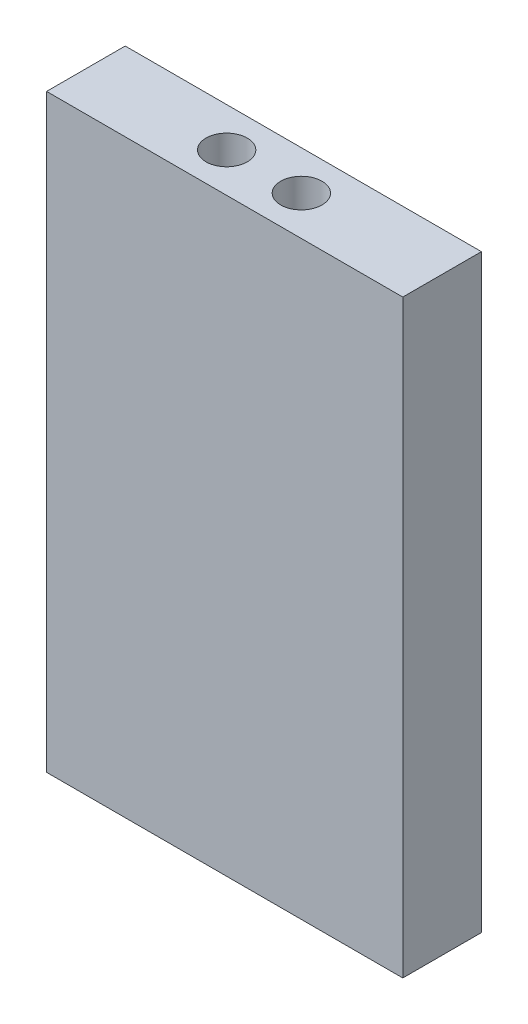
ISO-10303-21;
HEADER;
FILE_DESCRIPTION(('STEP AP214'),'2;1');
FILE_NAME('part.step','',(''),(''),'','','');
FILE_SCHEMA(('AUTOMOTIVE_DESIGN { 1 0 10303 214 1 1 1 1 }'));
ENDSEC;
DATA;
#1=APPLICATION_CONTEXT('core data for automotive mechanical design processes');
#2=APPLICATION_PROTOCOL_DEFINITION('international standard','automotive_design',2000,#1);
#3=PRODUCT_CONTEXT('',#1,'mechanical');
#4=PRODUCT('Part','Part','',(#3));
#5=PRODUCT_RELATED_PRODUCT_CATEGORY('part','',(#4));
#6=PRODUCT_DEFINITION_FORMATION('','',#4);
#7=PRODUCT_DEFINITION_CONTEXT('part definition',#1,'design');
#8=PRODUCT_DEFINITION('design','',#6,#7);
#9=PRODUCT_DEFINITION_SHAPE('','',#8);
#10=(LENGTH_UNIT() NAMED_UNIT(*) SI_UNIT(.MILLI.,.METRE.));
#11=(NAMED_UNIT(*) PLANE_ANGLE_UNIT() SI_UNIT($,.RADIAN.));
#12=(NAMED_UNIT(*) SI_UNIT($,.STERADIAN.) SOLID_ANGLE_UNIT());
#13=UNCERTAINTY_MEASURE_WITH_UNIT(LENGTH_MEASURE(1.E-05),#10,'distance_accuracy_value','');
#14=(GEOMETRIC_REPRESENTATION_CONTEXT(3) GLOBAL_UNCERTAINTY_ASSIGNED_CONTEXT((#13)) GLOBAL_UNIT_ASSIGNED_CONTEXT((#10,
#11,#12)) REPRESENTATION_CONTEXT('',''));
#15=CARTESIAN_POINT('',(0.,0.,0.));
#16=DIRECTION('',(0.,0.,1.));
#17=DIRECTION('',(1.,0.,0.));
#18=AXIS2_PLACEMENT_3D('',#15,#16,#17);
#19=CARTESIAN_POINT('',(-99.4350282485876,-57.909604519774,20.));
#20=DIRECTION('',(0.,1.,0.));
#21=DIRECTION('',(-1.,0.,0.));
#22=AXIS2_PLACEMENT_3D('',#19,#20,#21);
#23=PLANE('',#22);
#24=DIRECTION('',(1.,0.,0.));
#25=VECTOR('',#24,1.);
#26=CARTESIAN_POINT('',(-99.4350282485876,-57.909604519774,0.));
#27=LINE('',#26,#25);
#28=CARTESIAN_POINT('',(-94.7350282485876,-57.909604519774,0.));
#29=VERTEX_POINT('',#28);
#30=CARTESIAN_POINT('',(-4.13502824858761,-57.909604519774,0.));
#31=VERTEX_POINT('',#30);
#32=EDGE_CURVE('E107',#29,#31,#27,.T.);
#33=ORIENTED_EDGE('',*,*,#32,.T.);
#34=DIRECTION('',(0.,0.,1.));
#35=VECTOR('',#34,1.);
#36=CARTESIAN_POINT('',(-4.13502824858759,-57.909604519774,-150.073615269307));
#37=LINE('',#36,#35);
#38=CARTESIAN_POINT('',(-4.13502824858759,-57.909604519774,20.));
#39=VERTEX_POINT('',#38);
#40=EDGE_CURVE('E48',#31,#39,#37,.T.);
#41=ORIENTED_EDGE('',*,*,#40,.T.);
#42=DIRECTION('',(1.,0.,0.));
#43=VECTOR('',#42,1.);
#44=CARTESIAN_POINT('',(-99.4350282485876,-57.909604519774,20.));
#45=LINE('',#44,#43);
#46=CARTESIAN_POINT('',(-94.7350282485876,-57.909604519774,20.));
#47=VERTEX_POINT('',#46);
#48=EDGE_CURVE('E40',#47,#39,#45,.T.);
#49=ORIENTED_EDGE('',*,*,#48,.F.);
#50=DIRECTION('',(0.,0.,1.));
#51=VECTOR('',#50,1.);
#52=CARTESIAN_POINT('',(-94.7350282485876,-57.909604519774,-150.073615269307));
#53=LINE('',#52,#51);
#54=EDGE_CURVE('E90',#29,#47,#53,.T.);
#55=ORIENTED_EDGE('',*,*,#54,.F.);
#56=EDGE_LOOP('',(#33,#41,#49,#55));
#57=FACE_BOUND('',#56,.T.);
#58=ADVANCED_FACE('F32',(#57),#23,.F.);
#59=CARTESIAN_POINT('',(-99.4350282485876,92.090395480226,20.));
#60=DIRECTION('',(0.,-1.,0.));
#61=DIRECTION('',(0.,0.,-1.));
#62=AXIS2_PLACEMENT_3D('',#59,#60,#61);
#63=PLANE('',#62);
#64=CARTESIAN_POINT('',(-39.9350282485876,92.090395480226,10.));
#65=DIRECTION('',(0.,1.,0.));
#66=DIRECTION('',(0.,0.,1.));
#67=AXIS2_PLACEMENT_3D('',#64,#65,#66);
#68=CIRCLE('',#67,5.25);
#69=CARTESIAN_POINT('',(-39.9350282485876,92.090395480226,15.25));
#70=VERTEX_POINT('',#69);
#71=EDGE_CURVE('E92',#70,#70,#68,.T.);
#72=ORIENTED_EDGE('',*,*,#71,.F.);
#73=EDGE_LOOP('',(#72));
#74=FACE_BOUND('',#73,.T.);
#75=CARTESIAN_POINT('',(-58.9350282485876,92.090395480226,10.));
#76=DIRECTION('',(0.,1.,0.));
#77=DIRECTION('',(0.,0.,1.));
#78=AXIS2_PLACEMENT_3D('',#75,#76,#77);
#79=CIRCLE('',#78,5.25);
#80=CARTESIAN_POINT('',(-58.9350282485876,92.090395480226,15.25));
#81=VERTEX_POINT('',#80);
#82=EDGE_CURVE('E101',#81,#81,#79,.T.);
#83=ORIENTED_EDGE('',*,*,#82,.F.);
#84=EDGE_LOOP('',(#83));
#85=FACE_BOUND('',#84,.T.);
#86=DIRECTION('',(-1.,0.,0.));
#87=VECTOR('',#86,1.);
#88=CARTESIAN_POINT('',(-99.4350282485876,92.090395480226,20.));
#89=LINE('',#88,#87);
#90=CARTESIAN_POINT('',(-4.13502824858761,92.090395480226,20.));
#91=VERTEX_POINT('',#90);
#92=CARTESIAN_POINT('',(-94.7350282485876,92.090395480226,20.));
#93=VERTEX_POINT('',#92);
#94=EDGE_CURVE('E11',#91,#93,#89,.T.);
#95=ORIENTED_EDGE('',*,*,#94,.F.);
#96=DIRECTION('',(0.,0.,1.));
#97=VECTOR('',#96,1.);
#98=CARTESIAN_POINT('',(-4.13502824858761,92.090395480226,-150.073615269307));
#99=LINE('',#98,#97);
#100=CARTESIAN_POINT('',(-4.13502824858761,92.090395480226,0.));
#101=VERTEX_POINT('',#100);
#102=EDGE_CURVE('E71',#101,#91,#99,.T.);
#103=ORIENTED_EDGE('',*,*,#102,.F.);
#104=DIRECTION('',(-1.,0.,0.));
#105=VECTOR('',#104,1.);
#106=CARTESIAN_POINT('',(-99.4350282485876,92.090395480226,0.));
#107=LINE('',#106,#105);
#108=CARTESIAN_POINT('',(-94.7350282485876,92.090395480226,0.));
#109=VERTEX_POINT('',#108);
#110=EDGE_CURVE('E35',#101,#109,#107,.T.);
#111=ORIENTED_EDGE('',*,*,#110,.T.);
#112=DIRECTION('',(0.,0.,1.));
#113=VECTOR('',#112,1.);
#114=CARTESIAN_POINT('',(-94.7350282485876,92.090395480226,-150.073615269307));
#115=LINE('',#114,#113);
#116=EDGE_CURVE('E86',#109,#93,#115,.T.);
#117=ORIENTED_EDGE('',*,*,#116,.T.);
#118=EDGE_LOOP('',(#95,#103,#111,#117));
#119=FACE_BOUND('',#118,.T.);
#120=ADVANCED_FACE('F85',(#74,#85,#119),#63,.F.);
#121=CARTESIAN_POINT('',(0.,0.,20.));
#122=DIRECTION('',(0.,0.,1.));
#123=DIRECTION('',(1.,0.,0.));
#124=AXIS2_PLACEMENT_3D('',#121,#122,#123);
#125=PLANE('',#124);
#126=DIRECTION('',(0.,-1.,0.));
#127=VECTOR('',#126,1.);
#128=CARTESIAN_POINT('',(-4.13502824858761,92.090395480226,20.));
#129=LINE('',#128,#127);
#130=EDGE_CURVE('E74',#91,#39,#129,.T.);
#131=ORIENTED_EDGE('',*,*,#130,.F.);
#132=ORIENTED_EDGE('',*,*,#94,.T.);
#133=DIRECTION('',(0.,1.,0.));
#134=VECTOR('',#133,1.);
#135=CARTESIAN_POINT('',(-94.7350282485876,92.090395480226,20.));
#136=LINE('',#135,#134);
#137=EDGE_CURVE('E94',#47,#93,#136,.T.);
#138=ORIENTED_EDGE('',*,*,#137,.F.);
#139=ORIENTED_EDGE('',*,*,#48,.T.);
#140=EDGE_LOOP('',(#131,#132,#138,#139));
#141=FACE_BOUND('',#140,.T.);
#142=ADVANCED_FACE('F80',(#141),#125,.T.);
#143=CARTESIAN_POINT('',(0.,0.,0.));
#144=DIRECTION('',(0.,0.,1.));
#145=DIRECTION('',(1.,0.,0.));
#146=AXIS2_PLACEMENT_3D('',#143,#144,#145);
#147=PLANE('',#146);
#148=ORIENTED_EDGE('',*,*,#110,.F.);
#149=DIRECTION('',(0.,1.,0.));
#150=VECTOR('',#149,1.);
#151=CARTESIAN_POINT('',(-4.13502824858761,92.090395480226,0.));
#152=LINE('',#151,#150);
#153=EDGE_CURVE('E75',#31,#101,#152,.T.);
#154=ORIENTED_EDGE('',*,*,#153,.F.);
#155=ORIENTED_EDGE('',*,*,#32,.F.);
#156=DIRECTION('',(0.,-1.,0.));
#157=VECTOR('',#156,1.);
#158=CARTESIAN_POINT('',(-94.7350282485876,92.090395480226,0.));
#159=LINE('',#158,#157);
#160=EDGE_CURVE('E89',#109,#29,#159,.T.);
#161=ORIENTED_EDGE('',*,*,#160,.F.);
#162=EDGE_LOOP('',(#148,#154,#155,#161));
#163=FACE_BOUND('',#162,.T.);
#164=ADVANCED_FACE('F115',(#163),#147,.F.);
#165=CARTESIAN_POINT('',(-58.9350282485876,66.090395480226,10.));
#166=DIRECTION('',(0.,1.,0.));
#167=DIRECTION('',(0.,0.,1.));
#168=AXIS2_PLACEMENT_3D('',#165,#166,#167);
#169=CYLINDRICAL_SURFACE('',#168,5.25);
#170=CARTESIAN_POINT('',(-58.9350282485876,66.090395480226,10.));
#171=DIRECTION('',(0.,1.,0.));
#172=DIRECTION('',(0.,0.,1.));
#173=AXIS2_PLACEMENT_3D('',#170,#171,#172);
#174=CIRCLE('',#173,5.25);
#175=CARTESIAN_POINT('',(-58.9350282485876,66.090395480226,15.25));
#176=VERTEX_POINT('',#175);
#177=EDGE_CURVE('E104',#176,#176,#174,.T.);
#178=CARTESIAN_POINT('',(-58.9350282485876,66.090395480226,15.25));
#179=CARTESIAN_POINT('',(-58.9350282485876,66.3612288135593,15.25));
#180=CARTESIAN_POINT('',(-58.9350282485876,66.6320621468927,15.25));
#181=CARTESIAN_POINT('',(-58.9350282485876,67.1737288135593,15.25));
#182=CARTESIAN_POINT('',(-58.9350282485876,67.4445621468927,15.25));
#183=CARTESIAN_POINT('',(-58.9350282485876,67.9862288135593,15.25));
#184=CARTESIAN_POINT('',(-58.9350282485876,68.2570621468927,15.25));
#185=CARTESIAN_POINT('',(-58.9350282485876,68.7987288135593,15.25));
#186=CARTESIAN_POINT('',(-58.9350282485876,69.0695621468927,15.25));
#187=CARTESIAN_POINT('',(-58.9350282485876,69.6112288135593,15.25));
#188=CARTESIAN_POINT('',(-58.9350282485876,69.8820621468927,15.25));
#189=CARTESIAN_POINT('',(-58.9350282485876,70.4237288135593,15.25));
#190=CARTESIAN_POINT('',(-58.9350282485876,70.6945621468927,15.25));
#191=CARTESIAN_POINT('',(-58.9350282485876,71.2362288135593,15.25));
#192=CARTESIAN_POINT('',(-58.9350282485876,71.5070621468927,15.25));
#193=CARTESIAN_POINT('',(-58.9350282485876,72.0487288135593,15.25));
#194=CARTESIAN_POINT('',(-58.9350282485876,72.3195621468927,15.25));
#195=CARTESIAN_POINT('',(-58.9350282485876,72.8612288135593,15.25));
#196=CARTESIAN_POINT('',(-58.9350282485876,73.1320621468927,15.25));
#197=CARTESIAN_POINT('',(-58.9350282485876,73.6737288135593,15.25));
#198=CARTESIAN_POINT('',(-58.9350282485876,73.9445621468927,15.25));
#199=CARTESIAN_POINT('',(-58.9350282485876,74.4862288135593,15.25));
#200=CARTESIAN_POINT('',(-58.9350282485876,74.7570621468927,15.25));
#201=CARTESIAN_POINT('',(-58.9350282485876,75.2987288135593,15.25));
#202=CARTESIAN_POINT('',(-58.9350282485876,75.5695621468927,15.25));
#203=CARTESIAN_POINT('',(-58.9350282485876,76.1112288135593,15.25));
#204=CARTESIAN_POINT('',(-58.9350282485876,76.3820621468927,15.25));
#205=CARTESIAN_POINT('',(-58.9350282485876,76.9237288135593,15.25));
#206=CARTESIAN_POINT('',(-58.9350282485876,77.1945621468927,15.25));
#207=CARTESIAN_POINT('',(-58.9350282485876,77.7362288135593,15.25));
#208=CARTESIAN_POINT('',(-58.9350282485876,78.0070621468927,15.25));
#209=CARTESIAN_POINT('',(-58.9350282485876,78.5487288135593,15.25));
#210=CARTESIAN_POINT('',(-58.9350282485876,78.8195621468927,15.25));
#211=CARTESIAN_POINT('',(-58.9350282485876,79.3612288135593,15.25));
#212=CARTESIAN_POINT('',(-58.9350282485876,79.6320621468927,15.25));
#213=CARTESIAN_POINT('',(-58.9350282485876,80.1737288135593,15.25));
#214=CARTESIAN_POINT('',(-58.9350282485876,80.4445621468927,15.25));
#215=CARTESIAN_POINT('',(-58.9350282485876,80.9862288135593,15.25));
#216=CARTESIAN_POINT('',(-58.9350282485876,81.2570621468927,15.25));
#217=CARTESIAN_POINT('',(-58.9350282485876,81.7987288135593,15.25));
#218=CARTESIAN_POINT('',(-58.9350282485876,82.0695621468927,15.25));
#219=CARTESIAN_POINT('',(-58.9350282485876,82.6112288135593,15.25));
#220=CARTESIAN_POINT('',(-58.9350282485876,82.8820621468927,15.25));
#221=CARTESIAN_POINT('',(-58.9350282485876,83.4237288135593,15.25));
#222=CARTESIAN_POINT('',(-58.9350282485876,83.6945621468927,15.25));
#223=CARTESIAN_POINT('',(-58.9350282485876,84.2362288135593,15.25));
#224=CARTESIAN_POINT('',(-58.9350282485876,84.5070621468927,15.25));
#225=CARTESIAN_POINT('',(-58.9350282485876,85.0487288135593,15.25));
#226=CARTESIAN_POINT('',(-58.9350282485876,85.3195621468927,15.25));
#227=CARTESIAN_POINT('',(-58.9350282485876,85.8612288135593,15.25));
#228=CARTESIAN_POINT('',(-58.9350282485876,86.1320621468927,15.25));
#229=CARTESIAN_POINT('',(-58.9350282485876,86.6737288135593,15.25));
#230=CARTESIAN_POINT('',(-58.9350282485876,86.9445621468927,15.25));
#231=CARTESIAN_POINT('',(-58.9350282485876,87.4862288135593,15.25));
#232=CARTESIAN_POINT('',(-58.9350282485876,87.7570621468927,15.25));
#233=CARTESIAN_POINT('',(-58.9350282485876,88.2987288135593,15.25));
#234=CARTESIAN_POINT('',(-58.9350282485876,88.5695621468927,15.25));
#235=CARTESIAN_POINT('',(-58.9350282485876,89.1112288135593,15.25));
#236=CARTESIAN_POINT('',(-58.9350282485876,89.3820621468927,15.25));
#237=CARTESIAN_POINT('',(-58.9350282485876,89.9237288135593,15.25));
#238=CARTESIAN_POINT('',(-58.9350282485876,90.1945621468927,15.25));
#239=CARTESIAN_POINT('',(-58.9350282485876,90.7362288135593,15.25));
#240=CARTESIAN_POINT('',(-58.9350282485876,91.0070621468927,15.25));
#241=CARTESIAN_POINT('',(-58.9350282485876,91.5487288135593,15.25));
#242=CARTESIAN_POINT('',(-58.9350282485876,91.8195621468927,15.25));
#243=CARTESIAN_POINT('',(-58.9350282485876,92.090395480226,15.25));
#244=B_SPLINE_CURVE_WITH_KNOTS('',3,(#178,#179,#180,#181,#182,#183,#184,#185,#186,#187,#188,
#189,#190,#191,#192,#193,#194,#195,#196,#197,#198,#199,#200,#201,#202,#203,#204,#205,#206,#207,
#208,#209,#210,#211,#212,#213,#214,#215,#216,#217,#218,#219,#220,#221,#222,#223,#224,#225,#226,
#227,#228,#229,#230,#231,#232,#233,#234,#235,#236,#237,#238,#239,#240,#241,#242,#243),
.UNSPECIFIED.,.F.,.F.,(4,2,2,2,2,2,2,2,2,2,2,2,2,2,2,2,2,2,2,2,2,2,2,2,2,2,2,2,2,2,2,2,4),(0.,
0.812500000000008,1.625,2.43750000000001,3.25,4.06250000000001,4.875,5.68750000000001,
6.50000000000001,7.3125,8.12500000000001,8.9375,9.75000000000001,10.5625,11.375,12.1875,13.,
13.8125,14.625,15.4375,16.25,17.0625,17.875,18.6875,19.5,20.3125,21.125,21.9375,22.75,23.5625,
24.375,25.1875,26.),.UNSPECIFIED.);
#245=EDGE_CURVE('BSEAM144',#176,#81,#244,.T.);
#246=ORIENTED_EDGE('',*,*,#177,.F.);
#247=ORIENTED_EDGE('',*,*,#82,.T.);
#248=ORIENTED_EDGE('',*,*,#245,.T.);
#249=ORIENTED_EDGE('',*,*,#245,.F.);
#250=EDGE_LOOP('',(#246,#248,#247,#249));
#251=FACE_BOUND('',#250,.T.);
#252=ADVANCED_FACE('F144',(#251),#169,.F.);
#253=CARTESIAN_POINT('',(-58.9350282485876,66.090395480226,10.));
#254=DIRECTION('',(0.,1.,0.));
#255=DIRECTION('',(0.,0.,1.));
#256=AXIS2_PLACEMENT_3D('',#253,#254,#255);
#257=PLANE('',#256);
#258=ORIENTED_EDGE('',*,*,#177,.T.);
#259=EDGE_LOOP('',(#258));
#260=FACE_BOUND('',#259,.T.);
#261=ADVANCED_FACE('F148',(#260),#257,.T.);
#262=CARTESIAN_POINT('',(-39.9350282485876,66.090395480226,10.));
#263=DIRECTION('',(0.,1.,0.));
#264=DIRECTION('',(0.,0.,1.));
#265=AXIS2_PLACEMENT_3D('',#262,#263,#264);
#266=CYLINDRICAL_SURFACE('',#265,5.25);
#267=CARTESIAN_POINT('',(-39.9350282485876,66.090395480226,10.));
#268=DIRECTION('',(0.,1.,0.));
#269=DIRECTION('',(0.,0.,1.));
#270=AXIS2_PLACEMENT_3D('',#267,#268,#269);
#271=CIRCLE('',#270,5.25);
#272=CARTESIAN_POINT('',(-39.9350282485876,66.090395480226,15.25));
#273=VERTEX_POINT('',#272);
#274=EDGE_CURVE('E98',#273,#273,#271,.T.);
#275=CARTESIAN_POINT('',(-39.9350282485876,66.090395480226,15.25));
#276=CARTESIAN_POINT('',(-39.9350282485876,66.3612288135593,15.25));
#277=CARTESIAN_POINT('',(-39.9350282485876,66.6320621468927,15.25));
#278=CARTESIAN_POINT('',(-39.9350282485876,67.1737288135593,15.25));
#279=CARTESIAN_POINT('',(-39.9350282485876,67.4445621468927,15.25));
#280=CARTESIAN_POINT('',(-39.9350282485876,67.9862288135593,15.25));
#281=CARTESIAN_POINT('',(-39.9350282485876,68.2570621468927,15.25));
#282=CARTESIAN_POINT('',(-39.9350282485876,68.7987288135593,15.25));
#283=CARTESIAN_POINT('',(-39.9350282485876,69.0695621468927,15.25));
#284=CARTESIAN_POINT('',(-39.9350282485876,69.6112288135593,15.25));
#285=CARTESIAN_POINT('',(-39.9350282485876,69.8820621468927,15.25));
#286=CARTESIAN_POINT('',(-39.9350282485876,70.4237288135593,15.25));
#287=CARTESIAN_POINT('',(-39.9350282485876,70.6945621468927,15.25));
#288=CARTESIAN_POINT('',(-39.9350282485876,71.2362288135593,15.25));
#289=CARTESIAN_POINT('',(-39.9350282485876,71.5070621468927,15.25));
#290=CARTESIAN_POINT('',(-39.9350282485876,72.0487288135593,15.25));
#291=CARTESIAN_POINT('',(-39.9350282485876,72.3195621468927,15.25));
#292=CARTESIAN_POINT('',(-39.9350282485876,72.8612288135593,15.25));
#293=CARTESIAN_POINT('',(-39.9350282485876,73.1320621468927,15.25));
#294=CARTESIAN_POINT('',(-39.9350282485876,73.6737288135593,15.25));
#295=CARTESIAN_POINT('',(-39.9350282485876,73.9445621468927,15.25));
#296=CARTESIAN_POINT('',(-39.9350282485876,74.4862288135593,15.25));
#297=CARTESIAN_POINT('',(-39.9350282485876,74.7570621468927,15.25));
#298=CARTESIAN_POINT('',(-39.9350282485876,75.2987288135593,15.25));
#299=CARTESIAN_POINT('',(-39.9350282485876,75.5695621468927,15.25));
#300=CARTESIAN_POINT('',(-39.9350282485876,76.1112288135593,15.25));
#301=CARTESIAN_POINT('',(-39.9350282485876,76.3820621468927,15.25));
#302=CARTESIAN_POINT('',(-39.9350282485876,76.9237288135593,15.25));
#303=CARTESIAN_POINT('',(-39.9350282485876,77.1945621468927,15.25));
#304=CARTESIAN_POINT('',(-39.9350282485876,77.7362288135593,15.25));
#305=CARTESIAN_POINT('',(-39.9350282485876,78.0070621468927,15.25));
#306=CARTESIAN_POINT('',(-39.9350282485876,78.5487288135593,15.25));
#307=CARTESIAN_POINT('',(-39.9350282485876,78.8195621468927,15.25));
#308=CARTESIAN_POINT('',(-39.9350282485876,79.3612288135593,15.25));
#309=CARTESIAN_POINT('',(-39.9350282485876,79.6320621468927,15.25));
#310=CARTESIAN_POINT('',(-39.9350282485876,80.1737288135593,15.25));
#311=CARTESIAN_POINT('',(-39.9350282485876,80.4445621468927,15.25));
#312=CARTESIAN_POINT('',(-39.9350282485876,80.9862288135593,15.25));
#313=CARTESIAN_POINT('',(-39.9350282485876,81.2570621468927,15.25));
#314=CARTESIAN_POINT('',(-39.9350282485876,81.7987288135593,15.25));
#315=CARTESIAN_POINT('',(-39.9350282485876,82.0695621468927,15.25));
#316=CARTESIAN_POINT('',(-39.9350282485876,82.6112288135593,15.25));
#317=CARTESIAN_POINT('',(-39.9350282485876,82.8820621468927,15.25));
#318=CARTESIAN_POINT('',(-39.9350282485876,83.4237288135593,15.25));
#319=CARTESIAN_POINT('',(-39.9350282485876,83.6945621468927,15.25));
#320=CARTESIAN_POINT('',(-39.9350282485876,84.2362288135593,15.25));
#321=CARTESIAN_POINT('',(-39.9350282485876,84.5070621468927,15.25));
#322=CARTESIAN_POINT('',(-39.9350282485876,85.0487288135593,15.25));
#323=CARTESIAN_POINT('',(-39.9350282485876,85.3195621468927,15.25));
#324=CARTESIAN_POINT('',(-39.9350282485876,85.8612288135593,15.25));
#325=CARTESIAN_POINT('',(-39.9350282485876,86.1320621468927,15.25));
#326=CARTESIAN_POINT('',(-39.9350282485876,86.6737288135593,15.25));
#327=CARTESIAN_POINT('',(-39.9350282485876,86.9445621468927,15.25));
#328=CARTESIAN_POINT('',(-39.9350282485876,87.4862288135593,15.25));
#329=CARTESIAN_POINT('',(-39.9350282485876,87.7570621468927,15.25));
#330=CARTESIAN_POINT('',(-39.9350282485876,88.2987288135593,15.25));
#331=CARTESIAN_POINT('',(-39.9350282485876,88.5695621468927,15.25));
#332=CARTESIAN_POINT('',(-39.9350282485876,89.1112288135593,15.25));
#333=CARTESIAN_POINT('',(-39.9350282485876,89.3820621468927,15.25));
#334=CARTESIAN_POINT('',(-39.9350282485876,89.9237288135593,15.25));
#335=CARTESIAN_POINT('',(-39.9350282485876,90.1945621468927,15.25));
#336=CARTESIAN_POINT('',(-39.9350282485876,90.7362288135593,15.25));
#337=CARTESIAN_POINT('',(-39.9350282485876,91.0070621468927,15.25));
#338=CARTESIAN_POINT('',(-39.9350282485876,91.5487288135593,15.25));
#339=CARTESIAN_POINT('',(-39.9350282485876,91.8195621468927,15.25));
#340=CARTESIAN_POINT('',(-39.9350282485876,92.090395480226,15.25));
#341=B_SPLINE_CURVE_WITH_KNOTS('',3,(#275,#276,#277,#278,#279,#280,#281,#282,#283,#284,#285,
#286,#287,#288,#289,#290,#291,#292,#293,#294,#295,#296,#297,#298,#299,#300,#301,#302,#303,#304,
#305,#306,#307,#308,#309,#310,#311,#312,#313,#314,#315,#316,#317,#318,#319,#320,#321,#322,#323,
#324,#325,#326,#327,#328,#329,#330,#331,#332,#333,#334,#335,#336,#337,#338,#339,#340),
.UNSPECIFIED.,.F.,.F.,(4,2,2,2,2,2,2,2,2,2,2,2,2,2,2,2,2,2,2,2,2,2,2,2,2,2,2,2,2,2,2,2,4),(0.,
0.812500000000008,1.625,2.43750000000001,3.25,4.06250000000001,4.875,5.68750000000001,
6.50000000000001,7.3125,8.12500000000001,8.9375,9.75000000000001,10.5625,11.375,12.1875,13.,
13.8125,14.625,15.4375,16.25,17.0625,17.875,18.6875,19.5,20.3125,21.125,21.9375,22.75,23.5625,
24.375,25.1875,26.),.UNSPECIFIED.);
#342=EDGE_CURVE('BSEAM127',#273,#70,#341,.T.);
#343=ORIENTED_EDGE('',*,*,#274,.F.);
#344=ORIENTED_EDGE('',*,*,#71,.T.);
#345=ORIENTED_EDGE('',*,*,#342,.T.);
#346=ORIENTED_EDGE('',*,*,#342,.F.);
#347=EDGE_LOOP('',(#343,#345,#344,#346));
#348=FACE_BOUND('',#347,.T.);
#349=ADVANCED_FACE('F127',(#348),#266,.F.);
#350=CARTESIAN_POINT('',(-39.9350282485876,66.090395480226,10.));
#351=DIRECTION('',(0.,1.,0.));
#352=DIRECTION('',(0.,0.,1.));
#353=AXIS2_PLACEMENT_3D('',#350,#351,#352);
#354=PLANE('',#353);
#355=ORIENTED_EDGE('',*,*,#274,.T.);
#356=EDGE_LOOP('',(#355));
#357=FACE_BOUND('',#356,.T.);
#358=ADVANCED_FACE('F120',(#357),#354,.T.);
#359=CARTESIAN_POINT('',(-94.7350282485876,92.090395480226,-150.073615269307));
#360=DIRECTION('',(1.,0.,0.));
#361=DIRECTION('',(0.,1.,0.));
#362=AXIS2_PLACEMENT_3D('',#359,#360,#361);
#363=PLANE('',#362);
#364=ORIENTED_EDGE('',*,*,#160,.T.);
#365=ORIENTED_EDGE('',*,*,#54,.T.);
#366=ORIENTED_EDGE('',*,*,#137,.T.);
#367=ORIENTED_EDGE('',*,*,#116,.F.);
#368=EDGE_LOOP('',(#364,#365,#366,#367));
#369=FACE_BOUND('',#368,.T.);
#370=ADVANCED_FACE('F118',(#369),#363,.F.);
#371=CARTESIAN_POINT('',(-4.13502824858761,92.090395480226,-150.073615269307));
#372=DIRECTION('',(-1.,0.,0.));
#373=DIRECTION('',(0.,-1.,0.));
#374=AXIS2_PLACEMENT_3D('',#371,#372,#373);
#375=PLANE('',#374);
#376=ORIENTED_EDGE('',*,*,#153,.T.);
#377=ORIENTED_EDGE('',*,*,#102,.T.);
#378=ORIENTED_EDGE('',*,*,#130,.T.);
#379=ORIENTED_EDGE('',*,*,#40,.F.);
#380=EDGE_LOOP('',(#376,#377,#378,#379));
#381=FACE_BOUND('',#380,.T.);
#382=ADVANCED_FACE('F73',(#381),#375,.F.);
#383=CLOSED_SHELL('',(#58,#120,#142,#164,#252,#261,#349,#358,#370,#382));
#384=MANIFOLD_SOLID_BREP('B2',#383);
#385=ADVANCED_BREP_SHAPE_REPRESENTATION('',(#18,#384),#14);
#386=SHAPE_DEFINITION_REPRESENTATION(#9,#385);
ENDSEC;
END-ISO-10303-21;
